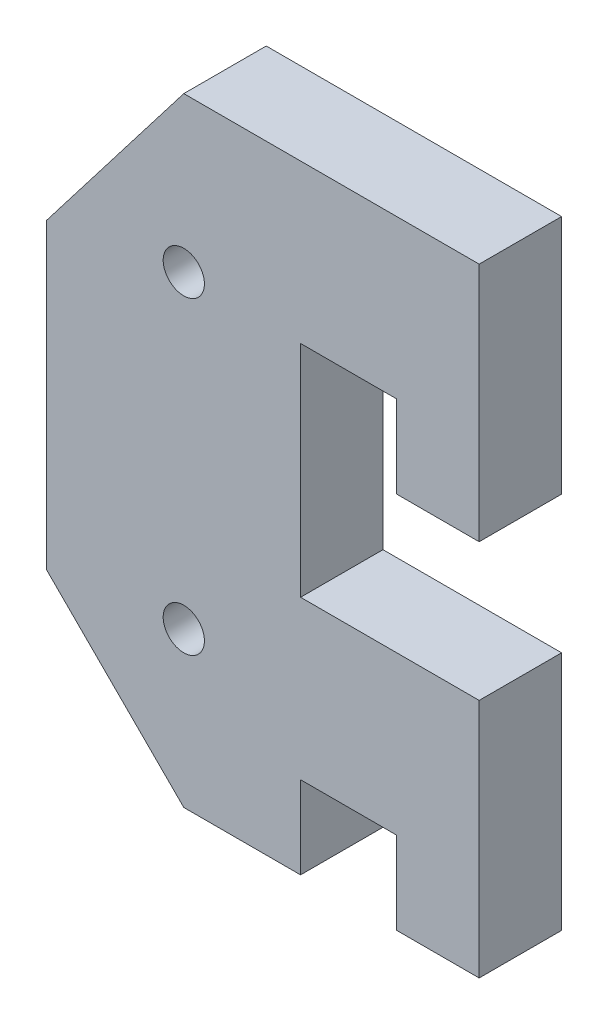
ISO-10303-21;
HEADER;
FILE_DESCRIPTION(('STEP AP214'),'2;1');
FILE_NAME('part.step','',(''),(''),'','','');
FILE_SCHEMA(('AUTOMOTIVE_DESIGN { 1 0 10303 214 1 1 1 1 }'));
ENDSEC;
DATA;
#1=APPLICATION_CONTEXT('core data for automotive mechanical design processes');
#2=APPLICATION_PROTOCOL_DEFINITION('international standard','automotive_design',2000,#1);
#3=PRODUCT_CONTEXT('',#1,'mechanical');
#4=PRODUCT('Part','Part','',(#3));
#5=PRODUCT_RELATED_PRODUCT_CATEGORY('part','',(#4));
#6=PRODUCT_DEFINITION_FORMATION('','',#4);
#7=PRODUCT_DEFINITION_CONTEXT('part definition',#1,'design');
#8=PRODUCT_DEFINITION('design','',#6,#7);
#9=PRODUCT_DEFINITION_SHAPE('','',#8);
#10=(LENGTH_UNIT() NAMED_UNIT(*) SI_UNIT(.MILLI.,.METRE.));
#11=(NAMED_UNIT(*) PLANE_ANGLE_UNIT() SI_UNIT($,.RADIAN.));
#12=(NAMED_UNIT(*) SI_UNIT($,.STERADIAN.) SOLID_ANGLE_UNIT());
#13=UNCERTAINTY_MEASURE_WITH_UNIT(LENGTH_MEASURE(1.E-05),#10,'distance_accuracy_value','');
#14=(GEOMETRIC_REPRESENTATION_CONTEXT(3) GLOBAL_UNCERTAINTY_ASSIGNED_CONTEXT((#13)) GLOBAL_UNIT_ASSIGNED_CONTEXT((#10,
#11,#12)) REPRESENTATION_CONTEXT('',''));
#15=CARTESIAN_POINT('',(0.,0.,0.));
#16=DIRECTION('',(0.,0.,1.));
#17=DIRECTION('',(1.,0.,0.));
#18=AXIS2_PLACEMENT_3D('',#15,#16,#17);
#19=CARTESIAN_POINT('',(0.,0.,6.));
#20=DIRECTION('',(0.,0.,-1.));
#21=DIRECTION('',(-1.,0.,0.));
#22=AXIS2_PLACEMENT_3D('',#19,#20,#21);
#23=PLANE('',#22);
#24=DIRECTION('',(0.,-1.,0.));
#25=VECTOR('',#24,1.);
#26=CARTESIAN_POINT('',(120.,-3.,6.));
#27=LINE('',#26,#25);
#28=CARTESIAN_POINT('',(120.,-3.,6.));
#29=VERTEX_POINT('',#28);
#30=CARTESIAN_POINT('',(120.,-25.,6.));
#31=VERTEX_POINT('',#30);
#32=EDGE_CURVE('E207',#29,#31,#27,.T.);
#33=ORIENTED_EDGE('',*,*,#32,.T.);
#34=DIRECTION('',(0.707106781186546,-0.707106781186549,0.));
#35=VECTOR('',#34,1.);
#36=CARTESIAN_POINT('',(130.,-35.,6.));
#37=LINE('',#36,#35);
#38=CARTESIAN_POINT('',(130.,-35.,6.));
#39=VERTEX_POINT('',#38);
#40=EDGE_CURVE('E113',#31,#39,#37,.T.);
#41=ORIENTED_EDGE('',*,*,#40,.T.);
#42=DIRECTION('',(1.,0.,0.));
#43=VECTOR('',#42,1.);
#44=CARTESIAN_POINT('',(135.5,-35.,6.));
#45=LINE('',#44,#43);
#46=CARTESIAN_POINT('',(138.5,-35.,6.));
#47=VERTEX_POINT('',#46);
#48=EDGE_CURVE('E245',#39,#47,#45,.T.);
#49=ORIENTED_EDGE('',*,*,#48,.T.);
#50=DIRECTION('',(0.,1.,0.));
#51=VECTOR('',#50,1.);
#52=CARTESIAN_POINT('',(138.5,-29.,6.));
#53=LINE('',#52,#51);
#54=CARTESIAN_POINT('',(138.5,-29.,6.));
#55=VERTEX_POINT('',#54);
#56=EDGE_CURVE('E266',#47,#55,#53,.T.);
#57=ORIENTED_EDGE('',*,*,#56,.T.);
#58=DIRECTION('',(1.,0.,0.));
#59=VECTOR('',#58,1.);
#60=CARTESIAN_POINT('',(145.5,-29.,6.));
#61=LINE('',#60,#59);
#62=CARTESIAN_POINT('',(145.5,-29.,6.));
#63=VERTEX_POINT('',#62);
#64=EDGE_CURVE('E263',#55,#63,#61,.T.);
#65=ORIENTED_EDGE('',*,*,#64,.T.);
#66=DIRECTION('',(0.,-1.,0.));
#67=VECTOR('',#66,1.);
#68=CARTESIAN_POINT('',(145.5,-35.,6.));
#69=LINE('',#68,#67);
#70=CARTESIAN_POINT('',(145.5,-35.,6.));
#71=VERTEX_POINT('',#70);
#72=EDGE_CURVE('E265',#63,#71,#69,.T.);
#73=ORIENTED_EDGE('',*,*,#72,.T.);
#74=DIRECTION('',(1.,0.,0.));
#75=VECTOR('',#74,1.);
#76=CARTESIAN_POINT('',(151.5,-35.,6.));
#77=LINE('',#76,#75);
#78=CARTESIAN_POINT('',(151.5,-35.,6.));
#79=VERTEX_POINT('',#78);
#80=EDGE_CURVE('E268',#71,#79,#77,.T.);
#81=ORIENTED_EDGE('',*,*,#80,.T.);
#82=DIRECTION('',(0.,1.,0.));
#83=VECTOR('',#82,1.);
#84=CARTESIAN_POINT('',(151.5,-17.5,6.));
#85=LINE('',#84,#83);
#86=CARTESIAN_POINT('',(151.5,-17.5,6.));
#87=VERTEX_POINT('',#86);
#88=EDGE_CURVE('E274',#79,#87,#85,.T.);
#89=ORIENTED_EDGE('',*,*,#88,.T.);
#90=DIRECTION('',(-1.,0.,0.));
#91=VECTOR('',#90,1.);
#92=CARTESIAN_POINT('',(138.5,-17.5,6.));
#93=LINE('',#92,#91);
#94=CARTESIAN_POINT('',(138.5,-17.5,6.));
#95=VERTEX_POINT('',#94);
#96=EDGE_CURVE('E276',#87,#95,#93,.T.);
#97=ORIENTED_EDGE('',*,*,#96,.T.);
#98=DIRECTION('',(0.,1.,0.));
#99=VECTOR('',#98,1.);
#100=CARTESIAN_POINT('',(138.5,-1.50000000000001,6.));
#101=LINE('',#100,#99);
#102=CARTESIAN_POINT('',(138.5,-1.50000000000001,6.));
#103=VERTEX_POINT('',#102);
#104=EDGE_CURVE('E278',#95,#103,#101,.T.);
#105=ORIENTED_EDGE('',*,*,#104,.T.);
#106=DIRECTION('',(1.,0.,0.));
#107=VECTOR('',#106,1.);
#108=CARTESIAN_POINT('',(145.5,-1.50000000000001,6.));
#109=LINE('',#108,#107);
#110=CARTESIAN_POINT('',(145.5,-1.50000000000001,6.));
#111=VERTEX_POINT('',#110);
#112=EDGE_CURVE('E280',#103,#111,#109,.T.);
#113=ORIENTED_EDGE('',*,*,#112,.T.);
#114=DIRECTION('',(0.,-1.,0.));
#115=VECTOR('',#114,1.);
#116=CARTESIAN_POINT('',(145.5,-7.50000000000001,6.));
#117=LINE('',#116,#115);
#118=CARTESIAN_POINT('',(145.5,-7.50000000000001,6.));
#119=VERTEX_POINT('',#118);
#120=EDGE_CURVE('E282',#111,#119,#117,.T.);
#121=ORIENTED_EDGE('',*,*,#120,.T.);
#122=DIRECTION('',(1.,0.,0.));
#123=VECTOR('',#122,1.);
#124=CARTESIAN_POINT('',(151.5,-7.5,6.));
#125=LINE('',#124,#123);
#126=CARTESIAN_POINT('',(151.5,-7.5,6.));
#127=VERTEX_POINT('',#126);
#128=EDGE_CURVE('E156',#119,#127,#125,.T.);
#129=ORIENTED_EDGE('',*,*,#128,.T.);
#130=DIRECTION('',(0.,1.,0.));
#131=VECTOR('',#130,1.);
#132=CARTESIAN_POINT('',(151.5,10.,6.));
#133=LINE('',#132,#131);
#134=CARTESIAN_POINT('',(151.5,10.,6.));
#135=VERTEX_POINT('',#134);
#136=EDGE_CURVE('E150',#127,#135,#133,.T.);
#137=ORIENTED_EDGE('',*,*,#136,.T.);
#138=DIRECTION('',(-1.,0.,0.));
#139=VECTOR('',#138,1.);
#140=CARTESIAN_POINT('',(135.5,10.,6.));
#141=LINE('',#140,#139);
#142=CARTESIAN_POINT('',(130.,10.,6.));
#143=VERTEX_POINT('',#142);
#144=EDGE_CURVE('E154',#135,#143,#141,.T.);
#145=ORIENTED_EDGE('',*,*,#144,.T.);
#146=DIRECTION('',(-0.60971076084969,-0.792623989104602,0.));
#147=VECTOR('',#146,1.);
#148=CARTESIAN_POINT('',(120.,-3.,6.));
#149=LINE('',#148,#147);
#150=EDGE_CURVE('E47',#143,#29,#149,.T.);
#151=ORIENTED_EDGE('',*,*,#150,.T.);
#152=EDGE_LOOP('',(#33,#41,#49,#57,#65,#73,#81,#89,#97,#105,#113,#121,#129,#137,#145,#151));
#153=FACE_BOUND('',#152,.T.);
#154=CARTESIAN_POINT('',(130.,-1.25,6.));
#155=DIRECTION('',(0.,0.,1.));
#156=DIRECTION('',(1.,0.,0.));
#157=AXIS2_PLACEMENT_3D('',#154,#155,#156);
#158=CIRCLE('',#157,1.5);
#159=CARTESIAN_POINT('',(131.5,-1.25,6.));
#160=VERTEX_POINT('',#159);
#161=EDGE_CURVE('E179',#160,#160,#158,.T.);
#162=ORIENTED_EDGE('',*,*,#161,.F.);
#163=EDGE_LOOP('',(#162));
#164=FACE_BOUND('',#163,.T.);
#165=CARTESIAN_POINT('',(130.,-23.75,6.));
#166=DIRECTION('',(0.,0.,1.));
#167=DIRECTION('',(1.,0.,0.));
#168=AXIS2_PLACEMENT_3D('',#165,#166,#167);
#169=CIRCLE('',#168,1.5);
#170=CARTESIAN_POINT('',(131.5,-23.75,6.));
#171=VERTEX_POINT('',#170);
#172=EDGE_CURVE('E495',#171,#171,#169,.T.);
#173=ORIENTED_EDGE('',*,*,#172,.F.);
#174=EDGE_LOOP('',(#173));
#175=FACE_BOUND('',#174,.T.);
#176=ADVANCED_FACE('F30',(#153,#164,#175),#23,.F.);
#177=CARTESIAN_POINT('',(0.,0.,0.));
#178=DIRECTION('',(0.,0.,-1.));
#179=DIRECTION('',(-1.,0.,0.));
#180=AXIS2_PLACEMENT_3D('',#177,#178,#179);
#181=PLANE('',#180);
#182=CARTESIAN_POINT('',(130.,-1.25,0.));
#183=DIRECTION('',(0.,0.,1.));
#184=DIRECTION('',(1.,0.,0.));
#185=AXIS2_PLACEMENT_3D('',#182,#183,#184);
#186=CIRCLE('',#185,1.5);
#187=CARTESIAN_POINT('',(131.5,-1.25,0.));
#188=VERTEX_POINT('',#187);
#189=EDGE_CURVE('E492',#188,#188,#186,.T.);
#190=ORIENTED_EDGE('',*,*,#189,.T.);
#191=EDGE_LOOP('',(#190));
#192=FACE_BOUND('',#191,.T.);
#193=DIRECTION('',(0.,-1.,0.));
#194=VECTOR('',#193,1.);
#195=CARTESIAN_POINT('',(120.,-3.,0.));
#196=LINE('',#195,#194);
#197=CARTESIAN_POINT('',(120.,-3.,0.));
#198=VERTEX_POINT('',#197);
#199=CARTESIAN_POINT('',(120.,-25.,0.));
#200=VERTEX_POINT('',#199);
#201=EDGE_CURVE('E175',#198,#200,#196,.T.);
#202=ORIENTED_EDGE('',*,*,#201,.F.);
#203=DIRECTION('',(-0.60971076084969,-0.792623989104602,0.));
#204=VECTOR('',#203,1.);
#205=CARTESIAN_POINT('',(120.,-3.,0.));
#206=LINE('',#205,#204);
#207=CARTESIAN_POINT('',(130.,10.,0.));
#208=VERTEX_POINT('',#207);
#209=EDGE_CURVE('E105',#208,#198,#206,.T.);
#210=ORIENTED_EDGE('',*,*,#209,.F.);
#211=DIRECTION('',(-1.,0.,0.));
#212=VECTOR('',#211,1.);
#213=CARTESIAN_POINT('',(130.,10.,0.));
#214=LINE('',#213,#212);
#215=CARTESIAN_POINT('',(151.5,10.,0.));
#216=VERTEX_POINT('',#215);
#217=EDGE_CURVE('E99',#216,#208,#214,.T.);
#218=ORIENTED_EDGE('',*,*,#217,.F.);
#219=DIRECTION('',(0.,1.,0.));
#220=VECTOR('',#219,1.);
#221=CARTESIAN_POINT('',(151.5,10.,0.));
#222=LINE('',#221,#220);
#223=CARTESIAN_POINT('',(151.5,-7.5,0.));
#224=VERTEX_POINT('',#223);
#225=EDGE_CURVE('E165',#224,#216,#222,.T.);
#226=ORIENTED_EDGE('',*,*,#225,.F.);
#227=DIRECTION('',(1.,0.,0.));
#228=VECTOR('',#227,1.);
#229=CARTESIAN_POINT('',(151.5,-7.5,0.));
#230=LINE('',#229,#228);
#231=CARTESIAN_POINT('',(145.5,-7.50000000000001,0.));
#232=VERTEX_POINT('',#231);
#233=EDGE_CURVE('E202',#232,#224,#230,.T.);
#234=ORIENTED_EDGE('',*,*,#233,.F.);
#235=DIRECTION('',(0.,-1.,0.));
#236=VECTOR('',#235,1.);
#237=CARTESIAN_POINT('',(145.5,-7.50000000000001,0.));
#238=LINE('',#237,#236);
#239=CARTESIAN_POINT('',(145.5,-1.50000000000001,0.));
#240=VERTEX_POINT('',#239);
#241=EDGE_CURVE('E200',#240,#232,#238,.T.);
#242=ORIENTED_EDGE('',*,*,#241,.F.);
#243=DIRECTION('',(1.,0.,0.));
#244=VECTOR('',#243,1.);
#245=CARTESIAN_POINT('',(145.5,-1.50000000000001,0.));
#246=LINE('',#245,#244);
#247=CARTESIAN_POINT('',(138.5,-1.50000000000001,0.));
#248=VERTEX_POINT('',#247);
#249=EDGE_CURVE('E198',#248,#240,#246,.T.);
#250=ORIENTED_EDGE('',*,*,#249,.F.);
#251=DIRECTION('',(0.,1.,0.));
#252=VECTOR('',#251,1.);
#253=CARTESIAN_POINT('',(138.5,-1.50000000000001,0.));
#254=LINE('',#253,#252);
#255=CARTESIAN_POINT('',(138.5,-17.5,0.));
#256=VERTEX_POINT('',#255);
#257=EDGE_CURVE('E196',#256,#248,#254,.T.);
#258=ORIENTED_EDGE('',*,*,#257,.F.);
#259=DIRECTION('',(-1.,0.,0.));
#260=VECTOR('',#259,1.);
#261=CARTESIAN_POINT('',(138.5,-17.5,0.));
#262=LINE('',#261,#260);
#263=CARTESIAN_POINT('',(151.5,-17.5,0.));
#264=VERTEX_POINT('',#263);
#265=EDGE_CURVE('E194',#264,#256,#262,.T.);
#266=ORIENTED_EDGE('',*,*,#265,.F.);
#267=DIRECTION('',(0.,1.,0.));
#268=VECTOR('',#267,1.);
#269=CARTESIAN_POINT('',(151.5,-17.5,0.));
#270=LINE('',#269,#268);
#271=CARTESIAN_POINT('',(151.5,-35.,0.));
#272=VERTEX_POINT('',#271);
#273=EDGE_CURVE('E192',#272,#264,#270,.T.);
#274=ORIENTED_EDGE('',*,*,#273,.F.);
#275=DIRECTION('',(1.,0.,0.));
#276=VECTOR('',#275,1.);
#277=CARTESIAN_POINT('',(151.5,-35.,0.));
#278=LINE('',#277,#276);
#279=CARTESIAN_POINT('',(145.5,-35.,0.));
#280=VERTEX_POINT('',#279);
#281=EDGE_CURVE('E190',#280,#272,#278,.T.);
#282=ORIENTED_EDGE('',*,*,#281,.F.);
#283=DIRECTION('',(0.,-1.,0.));
#284=VECTOR('',#283,1.);
#285=CARTESIAN_POINT('',(145.5,-35.,0.));
#286=LINE('',#285,#284);
#287=CARTESIAN_POINT('',(145.5,-29.,0.));
#288=VERTEX_POINT('',#287);
#289=EDGE_CURVE('E188',#288,#280,#286,.T.);
#290=ORIENTED_EDGE('',*,*,#289,.F.);
#291=DIRECTION('',(1.,0.,0.));
#292=VECTOR('',#291,1.);
#293=CARTESIAN_POINT('',(145.5,-29.,0.));
#294=LINE('',#293,#292);
#295=CARTESIAN_POINT('',(138.5,-29.,0.));
#296=VERTEX_POINT('',#295);
#297=EDGE_CURVE('E186',#296,#288,#294,.T.);
#298=ORIENTED_EDGE('',*,*,#297,.F.);
#299=DIRECTION('',(0.,1.,0.));
#300=VECTOR('',#299,1.);
#301=CARTESIAN_POINT('',(138.5,-29.,0.));
#302=LINE('',#301,#300);
#303=CARTESIAN_POINT('',(138.5,-35.,0.));
#304=VERTEX_POINT('',#303);
#305=EDGE_CURVE('E184',#304,#296,#302,.T.);
#306=ORIENTED_EDGE('',*,*,#305,.F.);
#307=DIRECTION('',(1.,0.,0.));
#308=VECTOR('',#307,1.);
#309=CARTESIAN_POINT('',(138.5,-35.,0.));
#310=LINE('',#309,#308);
#311=CARTESIAN_POINT('',(130.,-35.,0.));
#312=VERTEX_POINT('',#311);
#313=EDGE_CURVE('E182',#312,#304,#310,.T.);
#314=ORIENTED_EDGE('',*,*,#313,.F.);
#315=DIRECTION('',(0.707106781186546,-0.707106781186549,0.));
#316=VECTOR('',#315,1.);
#317=CARTESIAN_POINT('',(130.,-35.,0.));
#318=LINE('',#317,#316);
#319=EDGE_CURVE('E178',#200,#312,#318,.T.);
#320=ORIENTED_EDGE('',*,*,#319,.F.);
#321=EDGE_LOOP('',(#202,#210,#218,#226,#234,#242,#250,#258,#266,#274,#282,#290,#298,#306,#314,#320));
#322=FACE_BOUND('',#321,.T.);
#323=CARTESIAN_POINT('',(130.,-23.75,0.));
#324=DIRECTION('',(0.,0.,1.));
#325=DIRECTION('',(1.,0.,0.));
#326=AXIS2_PLACEMENT_3D('',#323,#324,#325);
#327=CIRCLE('',#326,1.5);
#328=CARTESIAN_POINT('',(131.5,-23.75,0.));
#329=VERTEX_POINT('',#328);
#330=EDGE_CURVE('E498',#329,#329,#327,.T.);
#331=ORIENTED_EDGE('',*,*,#330,.T.);
#332=EDGE_LOOP('',(#331));
#333=FACE_BOUND('',#332,.T.);
#334=ADVANCED_FACE('F250',(#192,#322,#333),#181,.T.);
#335=CARTESIAN_POINT('',(120.,-3.,6.));
#336=DIRECTION('',(1.,0.,0.));
#337=DIRECTION('',(0.,0.,-1.));
#338=AXIS2_PLACEMENT_3D('',#335,#336,#337);
#339=PLANE('',#338);
#340=ORIENTED_EDGE('',*,*,#201,.T.);
#341=DIRECTION('',(0.,0.,-1.));
#342=VECTOR('',#341,1.);
#343=CARTESIAN_POINT('',(120.,-25.,6.));
#344=LINE('',#343,#342);
#345=EDGE_CURVE('E11',#31,#200,#344,.T.);
#346=ORIENTED_EDGE('',*,*,#345,.F.);
#347=ORIENTED_EDGE('',*,*,#32,.F.);
#348=DIRECTION('',(0.,0.,-1.));
#349=VECTOR('',#348,1.);
#350=CARTESIAN_POINT('',(120.,-3.,6.));
#351=LINE('',#350,#349);
#352=EDGE_CURVE('E171',#29,#198,#351,.T.);
#353=ORIENTED_EDGE('',*,*,#352,.T.);
#354=EDGE_LOOP('',(#340,#346,#347,#353));
#355=FACE_BOUND('',#354,.T.);
#356=ADVANCED_FACE('F32',(#355),#339,.F.);
#357=CARTESIAN_POINT('',(130.,-35.,6.));
#358=DIRECTION('',(0.707106781186549,0.707106781186545,0.));
#359=DIRECTION('',(-0.707106781186546,0.707106781186549,0.));
#360=AXIS2_PLACEMENT_3D('',#357,#358,#359);
#361=PLANE('',#360);
#362=ORIENTED_EDGE('',*,*,#319,.T.);
#363=DIRECTION('',(0.,0.,-1.));
#364=VECTOR('',#363,1.);
#365=CARTESIAN_POINT('',(130.,-35.,6.));
#366=LINE('',#365,#364);
#367=EDGE_CURVE('E39',#39,#312,#366,.T.);
#368=ORIENTED_EDGE('',*,*,#367,.F.);
#369=ORIENTED_EDGE('',*,*,#40,.F.);
#370=ORIENTED_EDGE('',*,*,#345,.T.);
#371=EDGE_LOOP('',(#362,#368,#369,#370));
#372=FACE_BOUND('',#371,.T.);
#373=ADVANCED_FACE('F246',(#372),#361,.F.);
#374=CARTESIAN_POINT('',(138.5,-35.,6.));
#375=DIRECTION('',(0.,1.,0.));
#376=DIRECTION('',(0.,0.,1.));
#377=AXIS2_PLACEMENT_3D('',#374,#375,#376);
#378=PLANE('',#377);
#379=ORIENTED_EDGE('',*,*,#313,.T.);
#380=DIRECTION('',(0.,0.,-1.));
#381=VECTOR('',#380,1.);
#382=CARTESIAN_POINT('',(138.5,-35.,6.));
#383=LINE('',#382,#381);
#384=EDGE_CURVE('E238',#47,#304,#383,.T.);
#385=ORIENTED_EDGE('',*,*,#384,.F.);
#386=ORIENTED_EDGE('',*,*,#48,.F.);
#387=ORIENTED_EDGE('',*,*,#367,.T.);
#388=EDGE_LOOP('',(#379,#385,#386,#387));
#389=FACE_BOUND('',#388,.T.);
#390=ADVANCED_FACE('F243',(#389),#378,.F.);
#391=CARTESIAN_POINT('',(138.5,-29.,6.));
#392=DIRECTION('',(-1.,0.,0.));
#393=DIRECTION('',(0.,0.,1.));
#394=AXIS2_PLACEMENT_3D('',#391,#392,#393);
#395=PLANE('',#394);
#396=ORIENTED_EDGE('',*,*,#305,.T.);
#397=DIRECTION('',(0.,0.,-1.));
#398=VECTOR('',#397,1.);
#399=CARTESIAN_POINT('',(138.5,-29.,6.));
#400=LINE('',#399,#398);
#401=EDGE_CURVE('E235',#55,#296,#400,.T.);
#402=ORIENTED_EDGE('',*,*,#401,.F.);
#403=ORIENTED_EDGE('',*,*,#56,.F.);
#404=ORIENTED_EDGE('',*,*,#384,.T.);
#405=EDGE_LOOP('',(#396,#402,#403,#404));
#406=FACE_BOUND('',#405,.T.);
#407=ADVANCED_FACE('F257',(#406),#395,.F.);
#408=CARTESIAN_POINT('',(145.5,-29.,6.));
#409=DIRECTION('',(0.,1.,0.));
#410=DIRECTION('',(-1.,0.,0.));
#411=AXIS2_PLACEMENT_3D('',#408,#409,#410);
#412=PLANE('',#411);
#413=ORIENTED_EDGE('',*,*,#297,.T.);
#414=DIRECTION('',(0.,0.,-1.));
#415=VECTOR('',#414,1.);
#416=CARTESIAN_POINT('',(145.5,-29.,6.));
#417=LINE('',#416,#415);
#418=EDGE_CURVE('E232',#63,#288,#417,.T.);
#419=ORIENTED_EDGE('',*,*,#418,.F.);
#420=ORIENTED_EDGE('',*,*,#64,.F.);
#421=ORIENTED_EDGE('',*,*,#401,.T.);
#422=EDGE_LOOP('',(#413,#419,#420,#421));
#423=FACE_BOUND('',#422,.T.);
#424=ADVANCED_FACE('F261',(#423),#412,.F.);
#425=CARTESIAN_POINT('',(145.5,-35.,6.));
#426=DIRECTION('',(1.,0.,0.));
#427=DIRECTION('',(0.,0.,-1.));
#428=AXIS2_PLACEMENT_3D('',#425,#426,#427);
#429=PLANE('',#428);
#430=ORIENTED_EDGE('',*,*,#289,.T.);
#431=DIRECTION('',(0.,0.,-1.));
#432=VECTOR('',#431,1.);
#433=CARTESIAN_POINT('',(145.5,-35.,6.));
#434=LINE('',#433,#432);
#435=EDGE_CURVE('E229',#71,#280,#434,.T.);
#436=ORIENTED_EDGE('',*,*,#435,.F.);
#437=ORIENTED_EDGE('',*,*,#72,.F.);
#438=ORIENTED_EDGE('',*,*,#418,.T.);
#439=EDGE_LOOP('',(#430,#436,#437,#438));
#440=FACE_BOUND('',#439,.T.);
#441=ADVANCED_FACE('F318',(#440),#429,.F.);
#442=CARTESIAN_POINT('',(151.5,-35.,6.));
#443=DIRECTION('',(0.,1.,0.));
#444=DIRECTION('',(0.,0.,1.));
#445=AXIS2_PLACEMENT_3D('',#442,#443,#444);
#446=PLANE('',#445);
#447=ORIENTED_EDGE('',*,*,#281,.T.);
#448=DIRECTION('',(0.,0.,-1.));
#449=VECTOR('',#448,1.);
#450=CARTESIAN_POINT('',(151.5,-35.,6.));
#451=LINE('',#450,#449);
#452=EDGE_CURVE('E226',#79,#272,#451,.T.);
#453=ORIENTED_EDGE('',*,*,#452,.F.);
#454=ORIENTED_EDGE('',*,*,#80,.F.);
#455=ORIENTED_EDGE('',*,*,#435,.T.);
#456=EDGE_LOOP('',(#447,#453,#454,#455));
#457=FACE_BOUND('',#456,.T.);
#458=ADVANCED_FACE('F315',(#457),#446,.F.);
#459=CARTESIAN_POINT('',(151.5,-17.5,6.));
#460=DIRECTION('',(-1.,0.,0.));
#461=DIRECTION('',(0.,0.,1.));
#462=AXIS2_PLACEMENT_3D('',#459,#460,#461);
#463=PLANE('',#462);
#464=ORIENTED_EDGE('',*,*,#273,.T.);
#465=DIRECTION('',(0.,0.,-1.));
#466=VECTOR('',#465,1.);
#467=CARTESIAN_POINT('',(151.5,-17.5,6.));
#468=LINE('',#467,#466);
#469=EDGE_CURVE('E223',#87,#264,#468,.T.);
#470=ORIENTED_EDGE('',*,*,#469,.F.);
#471=ORIENTED_EDGE('',*,*,#88,.F.);
#472=ORIENTED_EDGE('',*,*,#452,.T.);
#473=EDGE_LOOP('',(#464,#470,#471,#472));
#474=FACE_BOUND('',#473,.T.);
#475=ADVANCED_FACE('F310',(#474),#463,.F.);
#476=CARTESIAN_POINT('',(138.5,-17.5,6.));
#477=DIRECTION('',(0.,-1.,0.));
#478=DIRECTION('',(1.,0.,0.));
#479=AXIS2_PLACEMENT_3D('',#476,#477,#478);
#480=PLANE('',#479);
#481=ORIENTED_EDGE('',*,*,#265,.T.);
#482=DIRECTION('',(0.,0.,-1.));
#483=VECTOR('',#482,1.);
#484=CARTESIAN_POINT('',(138.5,-17.5,6.));
#485=LINE('',#484,#483);
#486=EDGE_CURVE('E220',#95,#256,#485,.T.);
#487=ORIENTED_EDGE('',*,*,#486,.F.);
#488=ORIENTED_EDGE('',*,*,#96,.F.);
#489=ORIENTED_EDGE('',*,*,#469,.T.);
#490=EDGE_LOOP('',(#481,#487,#488,#489));
#491=FACE_BOUND('',#490,.T.);
#492=ADVANCED_FACE('F305',(#491),#480,.F.);
#493=CARTESIAN_POINT('',(138.5,-1.50000000000001,6.));
#494=DIRECTION('',(-1.,0.,0.));
#495=DIRECTION('',(0.,0.,1.));
#496=AXIS2_PLACEMENT_3D('',#493,#494,#495);
#497=PLANE('',#496);
#498=ORIENTED_EDGE('',*,*,#257,.T.);
#499=DIRECTION('',(0.,0.,-1.));
#500=VECTOR('',#499,1.);
#501=CARTESIAN_POINT('',(138.5,-1.50000000000001,6.));
#502=LINE('',#501,#500);
#503=EDGE_CURVE('E217',#103,#248,#502,.T.);
#504=ORIENTED_EDGE('',*,*,#503,.F.);
#505=ORIENTED_EDGE('',*,*,#104,.F.);
#506=ORIENTED_EDGE('',*,*,#486,.T.);
#507=EDGE_LOOP('',(#498,#504,#505,#506));
#508=FACE_BOUND('',#507,.T.);
#509=ADVANCED_FACE('F301',(#508),#497,.F.);
#510=CARTESIAN_POINT('',(145.5,-1.50000000000001,6.));
#511=DIRECTION('',(0.,1.,0.));
#512=DIRECTION('',(-1.,0.,0.));
#513=AXIS2_PLACEMENT_3D('',#510,#511,#512);
#514=PLANE('',#513);
#515=ORIENTED_EDGE('',*,*,#249,.T.);
#516=DIRECTION('',(0.,0.,-1.));
#517=VECTOR('',#516,1.);
#518=CARTESIAN_POINT('',(145.5,-1.50000000000001,6.));
#519=LINE('',#518,#517);
#520=EDGE_CURVE('E214',#111,#240,#519,.T.);
#521=ORIENTED_EDGE('',*,*,#520,.F.);
#522=ORIENTED_EDGE('',*,*,#112,.F.);
#523=ORIENTED_EDGE('',*,*,#503,.T.);
#524=EDGE_LOOP('',(#515,#521,#522,#523));
#525=FACE_BOUND('',#524,.T.);
#526=ADVANCED_FACE('F297',(#525),#514,.F.);
#527=CARTESIAN_POINT('',(145.5,-7.50000000000001,6.));
#528=DIRECTION('',(1.,0.,0.));
#529=DIRECTION('',(0.,0.,-1.));
#530=AXIS2_PLACEMENT_3D('',#527,#528,#529);
#531=PLANE('',#530);
#532=ORIENTED_EDGE('',*,*,#241,.T.);
#533=DIRECTION('',(0.,0.,-1.));
#534=VECTOR('',#533,1.);
#535=CARTESIAN_POINT('',(145.5,-7.50000000000001,6.));
#536=LINE('',#535,#534);
#537=EDGE_CURVE('E211',#119,#232,#536,.T.);
#538=ORIENTED_EDGE('',*,*,#537,.F.);
#539=ORIENTED_EDGE('',*,*,#120,.F.);
#540=ORIENTED_EDGE('',*,*,#520,.T.);
#541=EDGE_LOOP('',(#532,#538,#539,#540));
#542=FACE_BOUND('',#541,.T.);
#543=ADVANCED_FACE('F288',(#542),#531,.F.);
#544=CARTESIAN_POINT('',(151.5,-7.5,6.));
#545=DIRECTION('',(0.,1.,0.));
#546=DIRECTION('',(-1.,0.,0.));
#547=AXIS2_PLACEMENT_3D('',#544,#545,#546);
#548=PLANE('',#547);
#549=ORIENTED_EDGE('',*,*,#233,.T.);
#550=DIRECTION('',(0.,0.,-1.));
#551=VECTOR('',#550,1.);
#552=CARTESIAN_POINT('',(151.5,-7.5,6.));
#553=LINE('',#552,#551);
#554=EDGE_CURVE('E166',#127,#224,#553,.T.);
#555=ORIENTED_EDGE('',*,*,#554,.F.);
#556=ORIENTED_EDGE('',*,*,#128,.F.);
#557=ORIENTED_EDGE('',*,*,#537,.T.);
#558=EDGE_LOOP('',(#549,#555,#556,#557));
#559=FACE_BOUND('',#558,.T.);
#560=ADVANCED_FACE('F292',(#559),#548,.F.);
#561=CARTESIAN_POINT('',(151.5,10.,6.));
#562=DIRECTION('',(-1.,0.,0.));
#563=DIRECTION('',(0.,0.,1.));
#564=AXIS2_PLACEMENT_3D('',#561,#562,#563);
#565=PLANE('',#564);
#566=ORIENTED_EDGE('',*,*,#225,.T.);
#567=DIRECTION('',(0.,0.,-1.));
#568=VECTOR('',#567,1.);
#569=CARTESIAN_POINT('',(151.5,10.,6.));
#570=LINE('',#569,#568);
#571=EDGE_CURVE('E162',#135,#216,#570,.T.);
#572=ORIENTED_EDGE('',*,*,#571,.F.);
#573=ORIENTED_EDGE('',*,*,#136,.F.);
#574=ORIENTED_EDGE('',*,*,#554,.T.);
#575=EDGE_LOOP('',(#566,#572,#573,#574));
#576=FACE_BOUND('',#575,.T.);
#577=ADVANCED_FACE('F163',(#576),#565,.F.);
#578=CARTESIAN_POINT('',(130.,10.,6.));
#579=DIRECTION('',(0.,-1.,0.));
#580=DIRECTION('',(0.,0.,-1.));
#581=AXIS2_PLACEMENT_3D('',#578,#579,#580);
#582=PLANE('',#581);
#583=ORIENTED_EDGE('',*,*,#217,.T.);
#584=DIRECTION('',(0.,0.,-1.));
#585=VECTOR('',#584,1.);
#586=CARTESIAN_POINT('',(130.,10.,6.));
#587=LINE('',#586,#585);
#588=EDGE_CURVE('E167',#143,#208,#587,.T.);
#589=ORIENTED_EDGE('',*,*,#588,.F.);
#590=ORIENTED_EDGE('',*,*,#144,.F.);
#591=ORIENTED_EDGE('',*,*,#571,.T.);
#592=EDGE_LOOP('',(#583,#589,#590,#591));
#593=FACE_BOUND('',#592,.T.);
#594=ADVANCED_FACE('F169',(#593),#582,.F.);
#595=CARTESIAN_POINT('',(120.,-3.,6.));
#596=DIRECTION('',(0.792623989104602,-0.60971076084969,0.));
#597=DIRECTION('',(0.60971076084969,0.792623989104602,0.));
#598=AXIS2_PLACEMENT_3D('',#595,#596,#597);
#599=PLANE('',#598);
#600=ORIENTED_EDGE('',*,*,#209,.T.);
#601=ORIENTED_EDGE('',*,*,#352,.F.);
#602=ORIENTED_EDGE('',*,*,#150,.F.);
#603=ORIENTED_EDGE('',*,*,#588,.T.);
#604=EDGE_LOOP('',(#600,#601,#602,#603));
#605=FACE_BOUND('',#604,.T.);
#606=ADVANCED_FACE('F338',(#605),#599,.F.);
#607=CARTESIAN_POINT('',(130.,-1.25,6.));
#608=DIRECTION('',(0.,0.,-1.));
#609=DIRECTION('',(-1.,0.,0.));
#610=AXIS2_PLACEMENT_3D('',#607,#608,#609);
#611=CYLINDRICAL_SURFACE('',#610,1.5);
#612=ORIENTED_EDGE('',*,*,#161,.T.);
#613=EDGE_LOOP('',(#612));
#614=FACE_BOUND('',#613,.T.);
#615=ORIENTED_EDGE('',*,*,#189,.F.);
#616=EDGE_LOOP('',(#615));
#617=FACE_BOUND('',#616,.T.);
#618=ADVANCED_FACE('F335',(#614,#617),#611,.F.);
#619=CARTESIAN_POINT('',(130.,-23.75,6.));
#620=DIRECTION('',(0.,0.,-1.));
#621=DIRECTION('',(-1.,0.,0.));
#622=AXIS2_PLACEMENT_3D('',#619,#620,#621);
#623=CYLINDRICAL_SURFACE('',#622,1.5);
#624=ORIENTED_EDGE('',*,*,#172,.T.);
#625=EDGE_LOOP('',(#624));
#626=FACE_BOUND('',#625,.T.);
#627=ORIENTED_EDGE('',*,*,#330,.F.);
#628=EDGE_LOOP('',(#627));
#629=FACE_BOUND('',#628,.T.);
#630=ADVANCED_FACE('F398',(#626,#629),#623,.F.);
#631=CLOSED_SHELL('',(#176,#334,#356,#373,#390,#407,#424,#441,#458,#475,#492,#509,#526,#543,
#560,#577,#594,#606,#618,#630));
#632=MANIFOLD_SOLID_BREP('B2',#631);
#633=ADVANCED_BREP_SHAPE_REPRESENTATION('',(#18,#632),#14);
#634=SHAPE_DEFINITION_REPRESENTATION(#9,#633);
ENDSEC;
END-ISO-10303-21;
